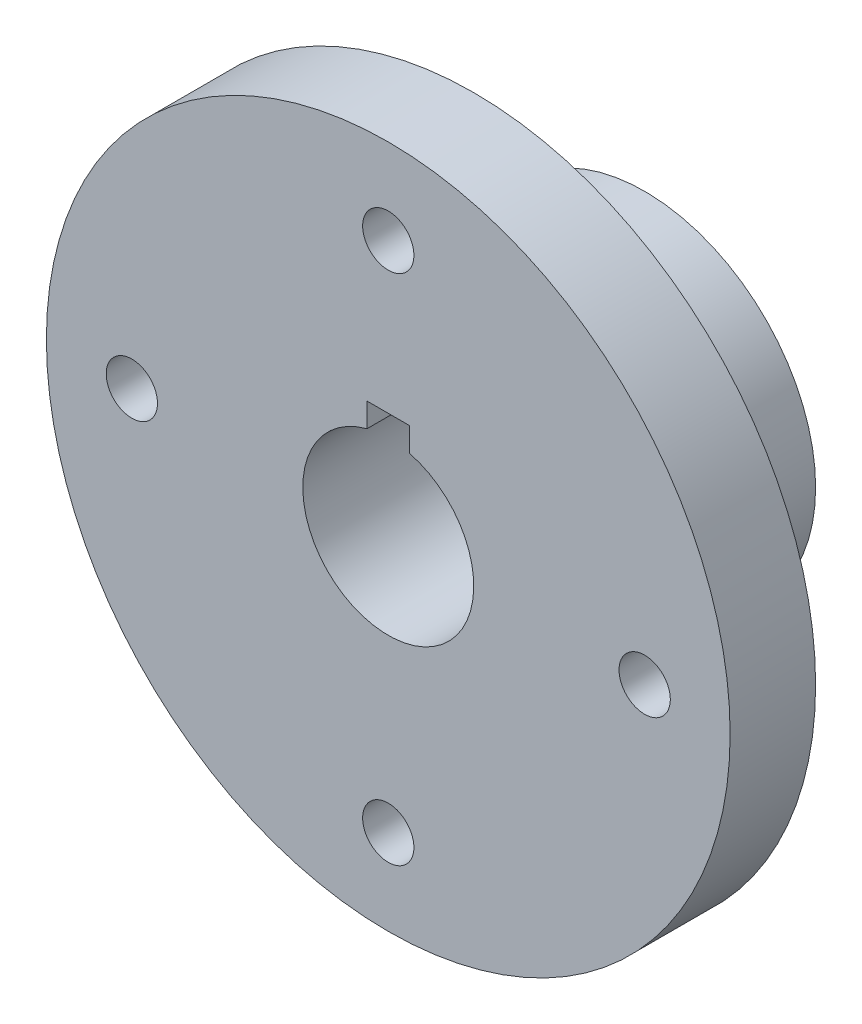
ISO-10303-21;
HEADER;
FILE_DESCRIPTION(('STEP AP214'),'2;1');
FILE_NAME('part.step','',(''),(''),'','','');
FILE_SCHEMA(('AUTOMOTIVE_DESIGN { 1 0 10303 214 1 1 1 1 }'));
ENDSEC;
DATA;
#1=APPLICATION_CONTEXT('core data for automotive mechanical design processes');
#2=APPLICATION_PROTOCOL_DEFINITION('international standard','automotive_design',2000,#1);
#3=PRODUCT_CONTEXT('',#1,'mechanical');
#4=PRODUCT('Part','Part','',(#3));
#5=PRODUCT_RELATED_PRODUCT_CATEGORY('part','',(#4));
#6=PRODUCT_DEFINITION_FORMATION('','',#4);
#7=PRODUCT_DEFINITION_CONTEXT('part definition',#1,'design');
#8=PRODUCT_DEFINITION('design','',#6,#7);
#9=PRODUCT_DEFINITION_SHAPE('','',#8);
#10=(LENGTH_UNIT() NAMED_UNIT(*) SI_UNIT(.MILLI.,.METRE.));
#11=(NAMED_UNIT(*) PLANE_ANGLE_UNIT() SI_UNIT($,.RADIAN.));
#12=(NAMED_UNIT(*) SI_UNIT($,.STERADIAN.) SOLID_ANGLE_UNIT());
#13=UNCERTAINTY_MEASURE_WITH_UNIT(LENGTH_MEASURE(1.E-05),#10,'distance_accuracy_value','');
#14=(GEOMETRIC_REPRESENTATION_CONTEXT(3) GLOBAL_UNCERTAINTY_ASSIGNED_CONTEXT((#13)) GLOBAL_UNIT_ASSIGNED_CONTEXT((#10,
#11,#12)) REPRESENTATION_CONTEXT('',''));
#15=CARTESIAN_POINT('',(0.,0.,0.));
#16=DIRECTION('',(0.,0.,1.));
#17=DIRECTION('',(1.,0.,0.));
#18=AXIS2_PLACEMENT_3D('',#15,#16,#17);
#19=CARTESIAN_POINT('',(0.,0.,50.));
#20=DIRECTION('',(0.,0.,-1.));
#21=DIRECTION('',(-1.,0.,0.));
#22=AXIS2_PLACEMENT_3D('',#19,#20,#21);
#23=CYLINDRICAL_SURFACE('',#22,200.);
#24=CARTESIAN_POINT('',(0.,0.,50.));
#25=DIRECTION('',(0.,0.,1.));
#26=DIRECTION('',(1.,0.,0.));
#27=AXIS2_PLACEMENT_3D('',#24,#25,#26);
#28=CIRCLE('',#27,200.);
#29=CARTESIAN_POINT('',(200.,0.,50.));
#30=VERTEX_POINT('',#29);
#31=EDGE_CURVE('E155',#30,#30,#28,.T.);
#32=ORIENTED_EDGE('',*,*,#31,.F.);
#33=EDGE_LOOP('',(#32));
#34=FACE_BOUND('',#33,.T.);
#35=CARTESIAN_POINT('',(0.,0.,0.));
#36=DIRECTION('',(0.,0.,1.));
#37=DIRECTION('',(1.,0.,0.));
#38=AXIS2_PLACEMENT_3D('',#35,#36,#37);
#39=CIRCLE('',#38,200.);
#40=CARTESIAN_POINT('',(200.,0.,0.));
#41=VERTEX_POINT('',#40);
#42=EDGE_CURVE('E149',#41,#41,#39,.T.);
#43=ORIENTED_EDGE('',*,*,#42,.T.);
#44=EDGE_LOOP('',(#43));
#45=FACE_BOUND('',#44,.T.);
#46=ADVANCED_FACE('F45',(#34,#45),#23,.T.);
#47=CARTESIAN_POINT('',(0.,0.,50.));
#48=DIRECTION('',(0.,0.,1.));
#49=DIRECTION('',(1.,0.,0.));
#50=AXIS2_PLACEMENT_3D('',#47,#48,#49);
#51=PLANE('',#50);
#52=DIRECTION('',(0.,1.,0.));
#53=VECTOR('',#52,1.);
#54=CARTESIAN_POINT('',(12.5,62.5,50.));
#55=LINE('',#54,#53);
#56=CARTESIAN_POINT('',(12.5,48.4122918275927,50.));
#57=VERTEX_POINT('',#56);
#58=CARTESIAN_POINT('',(12.5,62.5,50.));
#59=VERTEX_POINT('',#58);
#60=EDGE_CURVE('E89',#57,#59,#55,.T.);
#61=ORIENTED_EDGE('',*,*,#60,.F.);
#62=CARTESIAN_POINT('',(0.,0.,50.));
#63=DIRECTION('',(0.,0.,1.));
#64=DIRECTION('',(1.,0.,0.));
#65=AXIS2_PLACEMENT_3D('',#62,#63,#64);
#66=CIRCLE('',#65,50.);
#67=CARTESIAN_POINT('',(-12.5,48.4122918275927,50.));
#68=VERTEX_POINT('',#67);
#69=EDGE_CURVE('E121',#68,#57,#66,.T.);
#70=ORIENTED_EDGE('',*,*,#69,.F.);
#71=DIRECTION('',(0.,-1.,0.));
#72=VECTOR('',#71,1.);
#73=CARTESIAN_POINT('',(-12.5,62.5,50.));
#74=LINE('',#73,#72);
#75=CARTESIAN_POINT('',(-12.5,62.5,50.));
#76=VERTEX_POINT('',#75);
#77=EDGE_CURVE('E60',#76,#68,#74,.T.);
#78=ORIENTED_EDGE('',*,*,#77,.F.);
#79=DIRECTION('',(-1.,0.,0.));
#80=VECTOR('',#79,1.);
#81=CARTESIAN_POINT('',(-12.5,62.5,50.));
#82=LINE('',#81,#80);
#83=EDGE_CURVE('E111',#59,#76,#82,.T.);
#84=ORIENTED_EDGE('',*,*,#83,.F.);
#85=EDGE_LOOP('',(#61,#70,#78,#84));
#86=FACE_BOUND('',#85,.T.);
#87=CARTESIAN_POINT('',(0.,150.,50.));
#88=DIRECTION('',(0.,0.,1.));
#89=DIRECTION('',(1.,0.,0.));
#90=AXIS2_PLACEMENT_3D('',#87,#88,#89);
#91=CIRCLE('',#90,15.);
#92=CARTESIAN_POINT('',(15.,150.,50.));
#93=VERTEX_POINT('',#92);
#94=EDGE_CURVE('E129',#93,#93,#91,.T.);
#95=ORIENTED_EDGE('',*,*,#94,.F.);
#96=EDGE_LOOP('',(#95));
#97=FACE_BOUND('',#96,.T.);
#98=CARTESIAN_POINT('',(150.000000000004,4.23570186157978E-12,50.));
#99=DIRECTION('',(0.,0.,1.));
#100=DIRECTION('',(1.,0.,0.));
#101=AXIS2_PLACEMENT_3D('',#98,#99,#100);
#102=CIRCLE('',#101,15.0000000000033);
#103=CARTESIAN_POINT('',(165.000000000008,4.23570186157978E-12,50.));
#104=VERTEX_POINT('',#103);
#105=EDGE_CURVE('E134',#104,#104,#102,.T.);
#106=ORIENTED_EDGE('',*,*,#105,.F.);
#107=EDGE_LOOP('',(#106));
#108=FACE_BOUND('',#107,.T.);
#109=CARTESIAN_POINT('',(8.47140372315957E-12,-150.,50.));
#110=DIRECTION('',(0.,0.,1.));
#111=DIRECTION('',(1.,0.,0.));
#112=AXIS2_PLACEMENT_3D('',#109,#110,#111);
#113=CIRCLE('',#112,15.0000000000091);
#114=CARTESIAN_POINT('',(15.0000000000176,-150.,50.));
#115=VERTEX_POINT('',#114);
#116=EDGE_CURVE('E138',#115,#115,#113,.T.);
#117=ORIENTED_EDGE('',*,*,#116,.F.);
#118=EDGE_LOOP('',(#117));
#119=FACE_BOUND('',#118,.T.);
#120=CARTESIAN_POINT('',(-149.999999999996,-4.254071563567E-12,50.));
#121=DIRECTION('',(0.,0.,1.));
#122=DIRECTION('',(1.,0.,0.));
#123=AXIS2_PLACEMENT_3D('',#120,#121,#122);
#124=CIRCLE('',#123,15.0000000000068);
#125=CARTESIAN_POINT('',(-134.999999999989,-4.254071563567E-12,50.));
#126=VERTEX_POINT('',#125);
#127=EDGE_CURVE('E125',#126,#126,#124,.T.);
#128=ORIENTED_EDGE('',*,*,#127,.F.);
#129=EDGE_LOOP('',(#128));
#130=FACE_BOUND('',#129,.T.);
#131=ORIENTED_EDGE('',*,*,#31,.T.);
#132=EDGE_LOOP('',(#131));
#133=FACE_BOUND('',#132,.T.);
#134=ADVANCED_FACE('F180',(#86,#97,#108,#119,#130,#133),#51,.T.);
#135=CARTESIAN_POINT('',(0.,0.,0.));
#136=DIRECTION('',(0.,0.,1.));
#137=DIRECTION('',(1.,0.,0.));
#138=AXIS2_PLACEMENT_3D('',#135,#136,#137);
#139=PLANE('',#138);
#140=CARTESIAN_POINT('',(0.,150.,0.));
#141=DIRECTION('',(0.,0.,1.));
#142=DIRECTION('',(1.,0.,0.));
#143=AXIS2_PLACEMENT_3D('',#140,#141,#142);
#144=CIRCLE('',#143,15.);
#145=CARTESIAN_POINT('',(15.,150.,0.));
#146=VERTEX_POINT('',#145);
#147=EDGE_CURVE('E150',#146,#146,#144,.T.);
#148=ORIENTED_EDGE('',*,*,#147,.T.);
#149=EDGE_LOOP('',(#148));
#150=FACE_BOUND('',#149,.T.);
#151=CARTESIAN_POINT('',(150.000000000004,4.23570186157978E-12,0.));
#152=DIRECTION('',(0.,0.,1.));
#153=DIRECTION('',(1.,0.,0.));
#154=AXIS2_PLACEMENT_3D('',#151,#152,#153);
#155=CIRCLE('',#154,15.0000000000033);
#156=CARTESIAN_POINT('',(165.000000000008,4.23570186157978E-12,0.));
#157=VERTEX_POINT('',#156);
#158=EDGE_CURVE('E169',#157,#157,#155,.T.);
#159=ORIENTED_EDGE('',*,*,#158,.T.);
#160=EDGE_LOOP('',(#159));
#161=FACE_BOUND('',#160,.T.);
#162=CARTESIAN_POINT('',(8.47140372315957E-12,-150.,0.));
#163=DIRECTION('',(0.,0.,1.));
#164=DIRECTION('',(1.,0.,0.));
#165=AXIS2_PLACEMENT_3D('',#162,#163,#164);
#166=CIRCLE('',#165,15.0000000000091);
#167=CARTESIAN_POINT('',(15.0000000000176,-150.,0.));
#168=VERTEX_POINT('',#167);
#169=EDGE_CURVE('E165',#168,#168,#166,.T.);
#170=ORIENTED_EDGE('',*,*,#169,.T.);
#171=EDGE_LOOP('',(#170));
#172=FACE_BOUND('',#171,.T.);
#173=CARTESIAN_POINT('',(-149.999999999996,-4.254071563567E-12,0.));
#174=DIRECTION('',(0.,0.,1.));
#175=DIRECTION('',(1.,0.,0.));
#176=AXIS2_PLACEMENT_3D('',#173,#174,#175);
#177=CIRCLE('',#176,15.0000000000068);
#178=CARTESIAN_POINT('',(-134.999999999989,-4.254071563567E-12,0.));
#179=VERTEX_POINT('',#178);
#180=EDGE_CURVE('E133',#179,#179,#177,.T.);
#181=ORIENTED_EDGE('',*,*,#180,.T.);
#182=EDGE_LOOP('',(#181));
#183=FACE_BOUND('',#182,.T.);
#184=CARTESIAN_POINT('',(0.,0.,0.));
#185=DIRECTION('',(0.,0.,-1.));
#186=DIRECTION('',(-1.,0.,0.));
#187=AXIS2_PLACEMENT_3D('',#184,#185,#186);
#188=CIRCLE('',#187,100.);
#189=CARTESIAN_POINT('',(100.,0.,0.));
#190=VERTEX_POINT('',#189);
#191=EDGE_CURVE('E151',#190,#190,#188,.T.);
#192=ORIENTED_EDGE('',*,*,#191,.F.);
#193=EDGE_LOOP('',(#192));
#194=FACE_BOUND('',#193,.T.);
#195=ORIENTED_EDGE('',*,*,#42,.F.);
#196=EDGE_LOOP('',(#195));
#197=FACE_BOUND('',#196,.T.);
#198=ADVANCED_FACE('F183',(#150,#161,#172,#183,#194,#197),#139,.F.);
#199=CARTESIAN_POINT('',(0.,0.,-100.));
#200=DIRECTION('',(0.,0.,1.));
#201=DIRECTION('',(1.,0.,0.));
#202=AXIS2_PLACEMENT_3D('',#199,#200,#201);
#203=CYLINDRICAL_SURFACE('',#202,100.);
#204=CARTESIAN_POINT('',(0.,0.,-100.));
#205=DIRECTION('',(0.,0.,-1.));
#206=DIRECTION('',(-1.,0.,0.));
#207=AXIS2_PLACEMENT_3D('',#204,#205,#206);
#208=CIRCLE('',#207,100.);
#209=CARTESIAN_POINT('',(100.,0.,-100.));
#210=VERTEX_POINT('',#209);
#211=EDGE_CURVE('E145',#210,#210,#208,.T.);
#212=CARTESIAN_POINT('',(100.,0.,-100.));
#213=CARTESIAN_POINT('',(100.,0.,-98.9583333333333));
#214=CARTESIAN_POINT('',(100.,0.,-97.9166666666667));
#215=CARTESIAN_POINT('',(100.,0.,-95.8333333333333));
#216=CARTESIAN_POINT('',(100.,0.,-94.7916666666666));
#217=CARTESIAN_POINT('',(100.,0.,-92.7083333333333));
#218=CARTESIAN_POINT('',(100.,0.,-91.6666666666666));
#219=CARTESIAN_POINT('',(100.,0.,-89.5833333333333));
#220=CARTESIAN_POINT('',(100.,0.,-88.5416666666666));
#221=CARTESIAN_POINT('',(100.,0.,-86.4583333333333));
#222=CARTESIAN_POINT('',(100.,0.,-85.4166666666667));
#223=CARTESIAN_POINT('',(100.,0.,-83.3333333333333));
#224=CARTESIAN_POINT('',(100.,0.,-82.2916666666667));
#225=CARTESIAN_POINT('',(100.,0.,-80.2083333333333));
#226=CARTESIAN_POINT('',(100.,0.,-79.1666666666666));
#227=CARTESIAN_POINT('',(100.,0.,-77.0833333333333));
#228=CARTESIAN_POINT('',(100.,0.,-76.0416666666666));
#229=CARTESIAN_POINT('',(100.,0.,-73.9583333333333));
#230=CARTESIAN_POINT('',(100.,0.,-72.9166666666667));
#231=CARTESIAN_POINT('',(100.,0.,-70.8333333333333));
#232=CARTESIAN_POINT('',(100.,0.,-69.7916666666667));
#233=CARTESIAN_POINT('',(100.,0.,-67.7083333333333));
#234=CARTESIAN_POINT('',(100.,0.,-66.6666666666667));
#235=CARTESIAN_POINT('',(100.,0.,-64.5833333333333));
#236=CARTESIAN_POINT('',(100.,0.,-63.5416666666667));
#237=CARTESIAN_POINT('',(100.,0.,-61.4583333333333));
#238=CARTESIAN_POINT('',(100.,0.,-60.4166666666667));
#239=CARTESIAN_POINT('',(100.,0.,-58.3333333333333));
#240=CARTESIAN_POINT('',(100.,0.,-57.2916666666667));
#241=CARTESIAN_POINT('',(100.,0.,-55.2083333333333));
#242=CARTESIAN_POINT('',(100.,0.,-54.1666666666667));
#243=CARTESIAN_POINT('',(100.,0.,-52.0833333333333));
#244=CARTESIAN_POINT('',(100.,0.,-51.0416666666667));
#245=CARTESIAN_POINT('',(100.,0.,-48.9583333333333));
#246=CARTESIAN_POINT('',(100.,0.,-47.9166666666667));
#247=CARTESIAN_POINT('',(100.,0.,-45.8333333333333));
#248=CARTESIAN_POINT('',(100.,0.,-44.7916666666667));
#249=CARTESIAN_POINT('',(100.,0.,-42.7083333333333));
#250=CARTESIAN_POINT('',(100.,0.,-41.6666666666667));
#251=CARTESIAN_POINT('',(100.,0.,-39.5833333333333));
#252=CARTESIAN_POINT('',(100.,0.,-38.5416666666667));
#253=CARTESIAN_POINT('',(100.,0.,-36.4583333333333));
#254=CARTESIAN_POINT('',(100.,0.,-35.4166666666667));
#255=CARTESIAN_POINT('',(100.,0.,-33.3333333333333));
#256=CARTESIAN_POINT('',(100.,0.,-32.2916666666667));
#257=CARTESIAN_POINT('',(100.,0.,-30.2083333333333));
#258=CARTESIAN_POINT('',(100.,0.,-29.1666666666667));
#259=CARTESIAN_POINT('',(100.,0.,-27.0833333333333));
#260=CARTESIAN_POINT('',(100.,0.,-26.0416666666667));
#261=CARTESIAN_POINT('',(100.,0.,-23.9583333333333));
#262=CARTESIAN_POINT('',(100.,0.,-22.9166666666667));
#263=CARTESIAN_POINT('',(100.,0.,-20.8333333333333));
#264=CARTESIAN_POINT('',(100.,0.,-19.7916666666667));
#265=CARTESIAN_POINT('',(100.,0.,-17.7083333333333));
#266=CARTESIAN_POINT('',(100.,0.,-16.6666666666667));
#267=CARTESIAN_POINT('',(100.,0.,-14.5833333333333));
#268=CARTESIAN_POINT('',(100.,0.,-13.5416666666667));
#269=CARTESIAN_POINT('',(100.,0.,-11.4583333333333));
#270=CARTESIAN_POINT('',(100.,0.,-10.4166666666667));
#271=CARTESIAN_POINT('',(100.,0.,-8.33333333333333));
#272=CARTESIAN_POINT('',(100.,0.,-7.29166666666667));
#273=CARTESIAN_POINT('',(100.,0.,-5.20833333333334));
#274=CARTESIAN_POINT('',(100.,0.,-4.16666666666667));
#275=CARTESIAN_POINT('',(100.,0.,-2.08333333333334));
#276=CARTESIAN_POINT('',(100.,0.,-1.04166666666667));
#277=CARTESIAN_POINT('',(100.,0.,0.));
#278=B_SPLINE_CURVE_WITH_KNOTS('',3,(#212,#213,#214,#215,#216,#217,#218,#219,#220,#221,#222,
#223,#224,#225,#226,#227,#228,#229,#230,#231,#232,#233,#234,#235,#236,#237,#238,#239,#240,#241,
#242,#243,#244,#245,#246,#247,#248,#249,#250,#251,#252,#253,#254,#255,#256,#257,#258,#259,#260,
#261,#262,#263,#264,#265,#266,#267,#268,#269,#270,#271,#272,#273,#274,#275,#276,#277),
.UNSPECIFIED.,.F.,.F.,(4,2,2,2,2,2,2,2,2,2,2,2,2,2,2,2,2,2,2,2,2,2,2,2,2,2,2,2,2,2,2,2,4),(0.,
3.125,6.25000000000001,9.37500000000001,12.5,15.625,18.75,21.875,25.,28.125,31.25,34.375,37.5,
40.625,43.75,46.875,50.,53.125,56.25,59.375,62.5,65.625,68.75,71.875,75.,78.125,81.25,84.375,
87.5,90.625,93.75,96.875,100.),.UNSPECIFIED.);
#279=EDGE_CURVE('BSEAM200',#210,#190,#278,.T.);
#280=ORIENTED_EDGE('',*,*,#211,.F.);
#281=ORIENTED_EDGE('',*,*,#191,.T.);
#282=ORIENTED_EDGE('',*,*,#279,.T.);
#283=ORIENTED_EDGE('',*,*,#279,.F.);
#284=EDGE_LOOP('',(#280,#282,#281,#283));
#285=FACE_BOUND('',#284,.T.);
#286=ADVANCED_FACE('F200',(#285),#203,.T.);
#287=CARTESIAN_POINT('',(0.,0.,-100.));
#288=DIRECTION('',(0.,0.,-1.));
#289=DIRECTION('',(-1.,0.,0.));
#290=AXIS2_PLACEMENT_3D('',#287,#288,#289);
#291=PLANE('',#290);
#292=DIRECTION('',(0.,1.,0.));
#293=VECTOR('',#292,1.);
#294=CARTESIAN_POINT('',(12.5,62.5,-100.));
#295=LINE('',#294,#293);
#296=CARTESIAN_POINT('',(12.5,48.4122918275927,-100.));
#297=VERTEX_POINT('',#296);
#298=CARTESIAN_POINT('',(12.5,62.5,-100.));
#299=VERTEX_POINT('',#298);
#300=EDGE_CURVE('E87',#297,#299,#295,.T.);
#301=ORIENTED_EDGE('',*,*,#300,.T.);
#302=DIRECTION('',(-1.,0.,0.));
#303=VECTOR('',#302,1.);
#304=CARTESIAN_POINT('',(-12.5,62.5,-100.));
#305=LINE('',#304,#303);
#306=CARTESIAN_POINT('',(-12.5,62.5,-100.));
#307=VERTEX_POINT('',#306);
#308=EDGE_CURVE('E98',#299,#307,#305,.T.);
#309=ORIENTED_EDGE('',*,*,#308,.T.);
#310=DIRECTION('',(0.,-1.,0.));
#311=VECTOR('',#310,1.);
#312=CARTESIAN_POINT('',(-12.5,62.5,-100.));
#313=LINE('',#312,#311);
#314=CARTESIAN_POINT('',(-12.5,48.4122918275927,-100.));
#315=VERTEX_POINT('',#314);
#316=EDGE_CURVE('E95',#307,#315,#313,.T.);
#317=ORIENTED_EDGE('',*,*,#316,.T.);
#318=CARTESIAN_POINT('',(0.,0.,-100.));
#319=DIRECTION('',(0.,0.,1.));
#320=DIRECTION('',(1.,0.,0.));
#321=AXIS2_PLACEMENT_3D('',#318,#319,#320);
#322=CIRCLE('',#321,50.);
#323=EDGE_CURVE('E107',#315,#297,#322,.T.);
#324=ORIENTED_EDGE('',*,*,#323,.T.);
#325=EDGE_LOOP('',(#301,#309,#317,#324));
#326=FACE_BOUND('',#325,.T.);
#327=ORIENTED_EDGE('',*,*,#211,.T.);
#328=EDGE_LOOP('',(#327));
#329=FACE_BOUND('',#328,.T.);
#330=ADVANCED_FACE('F104',(#326,#329),#291,.T.);
#331=CARTESIAN_POINT('',(-149.999999999996,-4.254071563567E-12,-100.));
#332=DIRECTION('',(0.,0.,1.));
#333=DIRECTION('',(1.,0.,0.));
#334=AXIS2_PLACEMENT_3D('',#331,#332,#333);
#335=CYLINDRICAL_SURFACE('',#334,15.0000000000068);
#336=ORIENTED_EDGE('',*,*,#127,.T.);
#337=EDGE_LOOP('',(#336));
#338=FACE_BOUND('',#337,.T.);
#339=ORIENTED_EDGE('',*,*,#180,.F.);
#340=EDGE_LOOP('',(#339));
#341=FACE_BOUND('',#340,.T.);
#342=ADVANCED_FACE('F211',(#338,#341),#335,.F.);
#343=CARTESIAN_POINT('',(8.47140372315957E-12,-150.,-100.));
#344=DIRECTION('',(0.,0.,1.));
#345=DIRECTION('',(1.,0.,0.));
#346=AXIS2_PLACEMENT_3D('',#343,#344,#345);
#347=CYLINDRICAL_SURFACE('',#346,15.0000000000091);
#348=ORIENTED_EDGE('',*,*,#116,.T.);
#349=EDGE_LOOP('',(#348));
#350=FACE_BOUND('',#349,.T.);
#351=ORIENTED_EDGE('',*,*,#169,.F.);
#352=EDGE_LOOP('',(#351));
#353=FACE_BOUND('',#352,.T.);
#354=ADVANCED_FACE('F214',(#350,#353),#347,.F.);
#355=CARTESIAN_POINT('',(150.000000000004,4.23570186157978E-12,-100.));
#356=DIRECTION('',(0.,0.,1.));
#357=DIRECTION('',(1.,0.,0.));
#358=AXIS2_PLACEMENT_3D('',#355,#356,#357);
#359=CYLINDRICAL_SURFACE('',#358,15.0000000000033);
#360=ORIENTED_EDGE('',*,*,#105,.T.);
#361=EDGE_LOOP('',(#360));
#362=FACE_BOUND('',#361,.T.);
#363=ORIENTED_EDGE('',*,*,#158,.F.);
#364=EDGE_LOOP('',(#363));
#365=FACE_BOUND('',#364,.T.);
#366=ADVANCED_FACE('F218',(#362,#365),#359,.F.);
#367=CARTESIAN_POINT('',(0.,150.,-100.));
#368=DIRECTION('',(0.,0.,1.));
#369=DIRECTION('',(1.,0.,0.));
#370=AXIS2_PLACEMENT_3D('',#367,#368,#369);
#371=CYLINDRICAL_SURFACE('',#370,15.);
#372=ORIENTED_EDGE('',*,*,#94,.T.);
#373=EDGE_LOOP('',(#372));
#374=FACE_BOUND('',#373,.T.);
#375=ORIENTED_EDGE('',*,*,#147,.F.);
#376=EDGE_LOOP('',(#375));
#377=FACE_BOUND('',#376,.T.);
#378=ADVANCED_FACE('F222',(#374,#377),#371,.F.);
#379=CARTESIAN_POINT('',(0.,0.,-100.));
#380=DIRECTION('',(0.,0.,1.));
#381=DIRECTION('',(1.,0.,0.));
#382=AXIS2_PLACEMENT_3D('',#379,#380,#381);
#383=CYLINDRICAL_SURFACE('',#382,50.);
#384=ORIENTED_EDGE('',*,*,#69,.T.);
#385=DIRECTION('',(0.,0.,1.));
#386=VECTOR('',#385,1.);
#387=CARTESIAN_POINT('',(12.5,48.4122918275927,-100.));
#388=LINE('',#387,#386);
#389=EDGE_CURVE('E11',#57,#297,#388,.F.);
#390=ORIENTED_EDGE('',*,*,#389,.T.);
#391=ORIENTED_EDGE('',*,*,#323,.F.);
#392=DIRECTION('',(0.,0.,1.));
#393=VECTOR('',#392,1.);
#394=CARTESIAN_POINT('',(-12.5,48.4122918275927,-100.));
#395=LINE('',#394,#393);
#396=EDGE_CURVE('E53',#315,#68,#395,.T.);
#397=ORIENTED_EDGE('',*,*,#396,.T.);
#398=EDGE_LOOP('',(#384,#390,#391,#397));
#399=FACE_BOUND('',#398,.T.);
#400=ADVANCED_FACE('F178',(#399),#383,.F.);
#401=CARTESIAN_POINT('',(12.5,62.5,-100.));
#402=DIRECTION('',(1.,0.,0.));
#403=DIRECTION('',(0.,1.,0.));
#404=AXIS2_PLACEMENT_3D('',#401,#402,#403);
#405=PLANE('',#404);
#406=ORIENTED_EDGE('',*,*,#60,.T.);
#407=DIRECTION('',(0.,0.,1.));
#408=VECTOR('',#407,1.);
#409=CARTESIAN_POINT('',(12.5,62.5,-100.));
#410=LINE('',#409,#408);
#411=EDGE_CURVE('E83',#299,#59,#410,.T.);
#412=ORIENTED_EDGE('',*,*,#411,.F.);
#413=ORIENTED_EDGE('',*,*,#300,.F.);
#414=ORIENTED_EDGE('',*,*,#389,.F.);
#415=EDGE_LOOP('',(#406,#412,#413,#414));
#416=FACE_BOUND('',#415,.T.);
#417=ADVANCED_FACE('F85',(#416),#405,.F.);
#418=CARTESIAN_POINT('',(-12.5,62.5,-100.));
#419=DIRECTION('',(-1.,0.,0.));
#420=DIRECTION('',(0.,-1.,0.));
#421=AXIS2_PLACEMENT_3D('',#418,#419,#420);
#422=PLANE('',#421);
#423=ORIENTED_EDGE('',*,*,#316,.F.);
#424=DIRECTION('',(0.,0.,1.));
#425=VECTOR('',#424,1.);
#426=CARTESIAN_POINT('',(-12.5,62.5,-100.));
#427=LINE('',#426,#425);
#428=EDGE_CURVE('E94',#307,#76,#427,.T.);
#429=ORIENTED_EDGE('',*,*,#428,.T.);
#430=ORIENTED_EDGE('',*,*,#77,.T.);
#431=ORIENTED_EDGE('',*,*,#396,.F.);
#432=EDGE_LOOP('',(#423,#429,#430,#431));
#433=FACE_BOUND('',#432,.T.);
#434=ADVANCED_FACE('F231',(#433),#422,.F.);
#435=CARTESIAN_POINT('',(-12.5,62.5,-100.));
#436=DIRECTION('',(0.,1.,0.));
#437=DIRECTION('',(0.,0.,1.));
#438=AXIS2_PLACEMENT_3D('',#435,#436,#437);
#439=PLANE('',#438);
#440=ORIENTED_EDGE('',*,*,#83,.T.);
#441=ORIENTED_EDGE('',*,*,#428,.F.);
#442=ORIENTED_EDGE('',*,*,#308,.F.);
#443=ORIENTED_EDGE('',*,*,#411,.T.);
#444=EDGE_LOOP('',(#440,#441,#442,#443));
#445=FACE_BOUND('',#444,.T.);
#446=ADVANCED_FACE('F99',(#445),#439,.F.);
#447=CLOSED_SHELL('',(#46,#134,#198,#286,#330,#342,#354,#366,#378,#400,#417,#434,#446));
#448=MANIFOLD_SOLID_BREP('B2',#447);
#449=ADVANCED_BREP_SHAPE_REPRESENTATION('',(#18,#448),#14);
#450=SHAPE_DEFINITION_REPRESENTATION(#9,#449);
ENDSEC;
END-ISO-10303-21;
